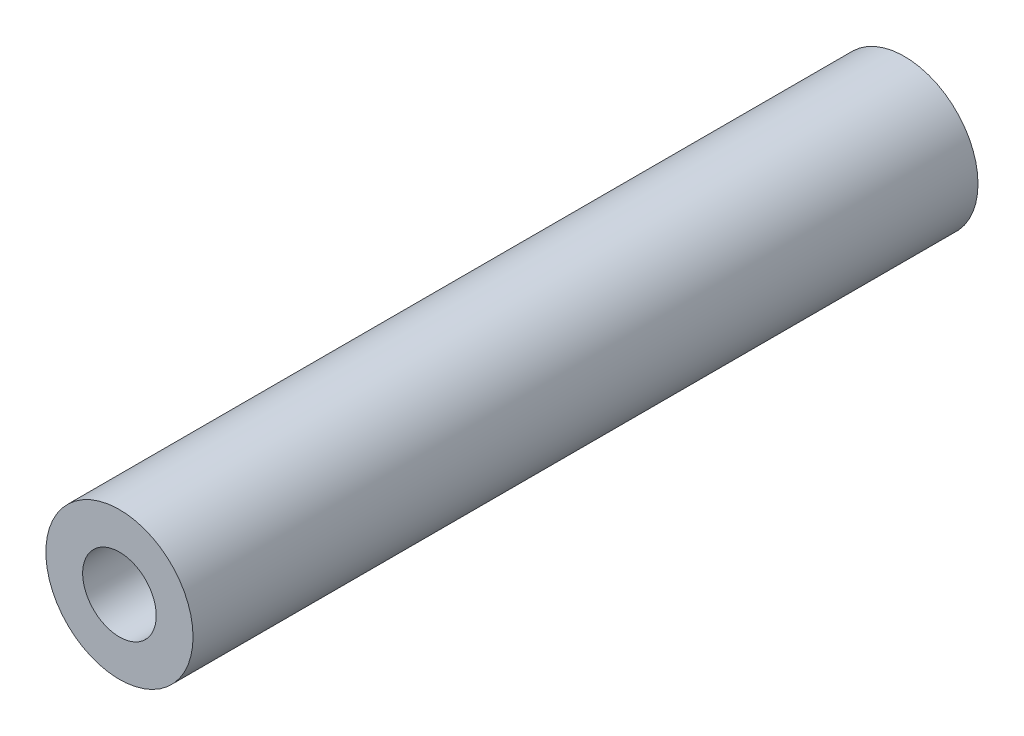
ISO-10303-21;
HEADER;
FILE_DESCRIPTION(('STEP AP214'),'2;1');
FILE_NAME('part.step','',(''),(''),'','','');
FILE_SCHEMA(('AUTOMOTIVE_DESIGN { 1 0 10303 214 1 1 1 1 }'));
ENDSEC;
DATA;
#1=APPLICATION_CONTEXT('core data for automotive mechanical design processes');
#2=APPLICATION_PROTOCOL_DEFINITION('international standard','automotive_design',2000,#1);
#3=PRODUCT_CONTEXT('',#1,'mechanical');
#4=PRODUCT('Part','Part','',(#3));
#5=PRODUCT_RELATED_PRODUCT_CATEGORY('part','',(#4));
#6=PRODUCT_DEFINITION_FORMATION('','',#4);
#7=PRODUCT_DEFINITION_CONTEXT('part definition',#1,'design');
#8=PRODUCT_DEFINITION('design','',#6,#7);
#9=PRODUCT_DEFINITION_SHAPE('','',#8);
#10=(LENGTH_UNIT() NAMED_UNIT(*) SI_UNIT(.MILLI.,.METRE.));
#11=(NAMED_UNIT(*) PLANE_ANGLE_UNIT() SI_UNIT($,.RADIAN.));
#12=(NAMED_UNIT(*) SI_UNIT($,.STERADIAN.) SOLID_ANGLE_UNIT());
#13=UNCERTAINTY_MEASURE_WITH_UNIT(LENGTH_MEASURE(1.E-05),#10,'distance_accuracy_value','');
#14=(GEOMETRIC_REPRESENTATION_CONTEXT(3) GLOBAL_UNCERTAINTY_ASSIGNED_CONTEXT((#13)) GLOBAL_UNIT_ASSIGNED_CONTEXT((#10,
#11,#12)) REPRESENTATION_CONTEXT('',''));
#15=CARTESIAN_POINT('',(0.,0.,0.));
#16=DIRECTION('',(0.,0.,1.));
#17=DIRECTION('',(1.,0.,0.));
#18=AXIS2_PLACEMENT_3D('',#15,#16,#17);
#19=CARTESIAN_POINT('',(0.,0.,32.));
#20=DIRECTION('',(0.,0.,1.));
#21=DIRECTION('',(1.,0.,0.));
#22=AXIS2_PLACEMENT_3D('',#19,#20,#21);
#23=PLANE('',#22);
#24=CARTESIAN_POINT('',(0.,0.,32.));
#25=DIRECTION('',(0.,0.,1.));
#26=DIRECTION('',(1.,0.,0.));
#27=AXIS2_PLACEMENT_3D('',#24,#25,#26);
#28=CIRCLE('',#27,3.);
#29=CARTESIAN_POINT('',(3.,0.,32.));
#30=VERTEX_POINT('',#29);
#31=EDGE_CURVE('E10',#30,#30,#28,.T.);
#32=ORIENTED_EDGE('',*,*,#31,.T.);
#33=EDGE_LOOP('',(#32));
#34=FACE_BOUND('',#33,.T.);
#35=CARTESIAN_POINT('',(0.,0.,32.));
#36=DIRECTION('',(0.,0.,1.));
#37=DIRECTION('',(1.,0.,0.));
#38=AXIS2_PLACEMENT_3D('',#35,#36,#37);
#39=CIRCLE('',#38,1.5);
#40=CARTESIAN_POINT('',(1.5,0.,32.));
#41=VERTEX_POINT('',#40);
#42=EDGE_CURVE('E41',#41,#41,#39,.T.);
#43=ORIENTED_EDGE('',*,*,#42,.F.);
#44=EDGE_LOOP('',(#43));
#45=FACE_BOUND('',#44,.T.);
#46=ADVANCED_FACE('F30',(#34,#45),#23,.T.);
#47=CARTESIAN_POINT('',(0.,0.,0.));
#48=DIRECTION('',(0.,0.,1.));
#49=DIRECTION('',(1.,0.,0.));
#50=AXIS2_PLACEMENT_3D('',#47,#48,#49);
#51=PLANE('',#50);
#52=CARTESIAN_POINT('',(0.,0.,0.));
#53=DIRECTION('',(0.,0.,1.));
#54=DIRECTION('',(1.,0.,0.));
#55=AXIS2_PLACEMENT_3D('',#52,#53,#54);
#56=CIRCLE('',#55,3.);
#57=CARTESIAN_POINT('',(3.,0.,0.));
#58=VERTEX_POINT('',#57);
#59=EDGE_CURVE('E34',#58,#58,#56,.T.);
#60=ORIENTED_EDGE('',*,*,#59,.F.);
#61=EDGE_LOOP('',(#60));
#62=FACE_BOUND('',#61,.T.);
#63=CARTESIAN_POINT('',(0.,0.,0.));
#64=DIRECTION('',(0.,0.,1.));
#65=DIRECTION('',(1.,0.,0.));
#66=AXIS2_PLACEMENT_3D('',#63,#64,#65);
#67=CIRCLE('',#66,1.5);
#68=CARTESIAN_POINT('',(1.5,0.,0.));
#69=VERTEX_POINT('',#68);
#70=EDGE_CURVE('E43',#69,#69,#67,.T.);
#71=ORIENTED_EDGE('',*,*,#70,.T.);
#72=EDGE_LOOP('',(#71));
#73=FACE_BOUND('',#72,.T.);
#74=ADVANCED_FACE('F53',(#62,#73),#51,.F.);
#75=CARTESIAN_POINT('',(0.,0.,32.));
#76=DIRECTION('',(0.,0.,-1.));
#77=DIRECTION('',(-1.,0.,0.));
#78=AXIS2_PLACEMENT_3D('',#75,#76,#77);
#79=CYLINDRICAL_SURFACE('',#78,3.);
#80=ORIENTED_EDGE('',*,*,#31,.F.);
#81=EDGE_LOOP('',(#80));
#82=FACE_BOUND('',#81,.T.);
#83=ORIENTED_EDGE('',*,*,#59,.T.);
#84=EDGE_LOOP('',(#83));
#85=FACE_BOUND('',#84,.T.);
#86=ADVANCED_FACE('F32',(#82,#85),#79,.T.);
#87=CARTESIAN_POINT('',(0.,0.,32.));
#88=DIRECTION('',(0.,0.,-1.));
#89=DIRECTION('',(-1.,0.,0.));
#90=AXIS2_PLACEMENT_3D('',#87,#88,#89);
#91=CYLINDRICAL_SURFACE('',#90,1.5);
#92=ORIENTED_EDGE('',*,*,#42,.T.);
#93=EDGE_LOOP('',(#92));
#94=FACE_BOUND('',#93,.T.);
#95=ORIENTED_EDGE('',*,*,#70,.F.);
#96=EDGE_LOOP('',(#95));
#97=FACE_BOUND('',#96,.T.);
#98=ADVANCED_FACE('F49',(#94,#97),#91,.F.);
#99=CLOSED_SHELL('',(#46,#74,#86,#98));
#100=MANIFOLD_SOLID_BREP('B2',#99);
#101=ADVANCED_BREP_SHAPE_REPRESENTATION('',(#18,#100),#14);
#102=SHAPE_DEFINITION_REPRESENTATION(#9,#101);
ENDSEC;
END-ISO-10303-21;
